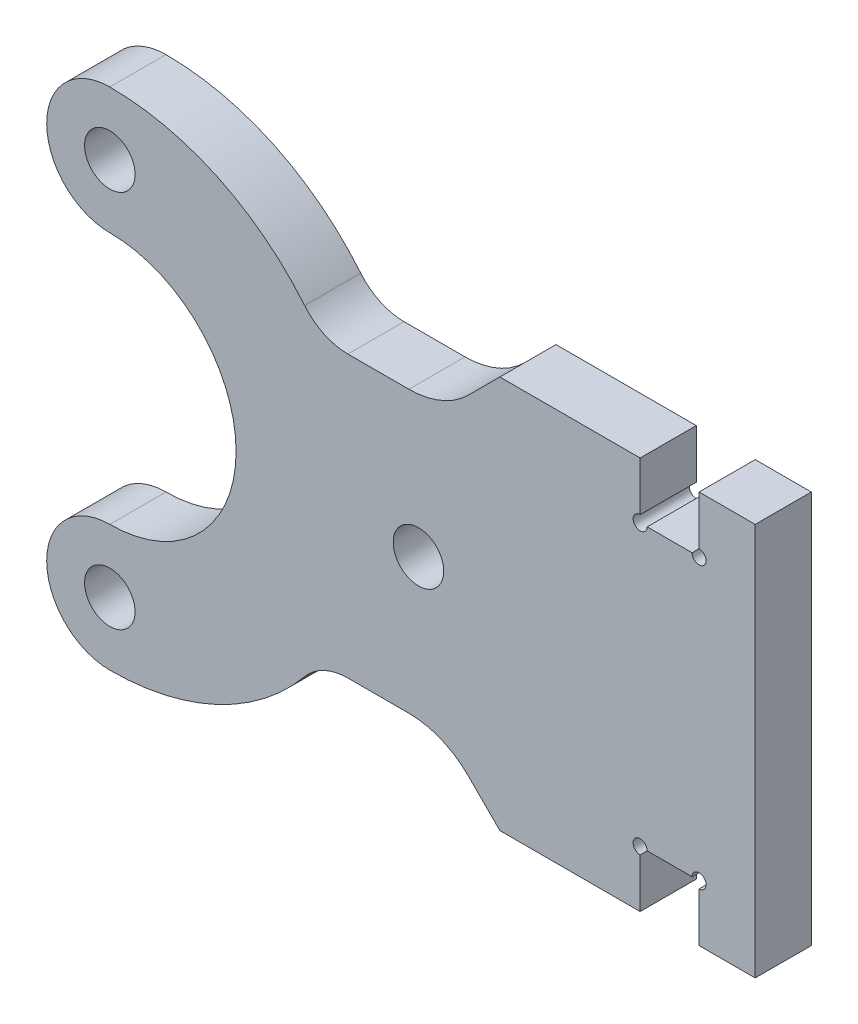
ISO-10303-21;
HEADER;
FILE_DESCRIPTION(('STEP AP214'),'2;1');
FILE_NAME('part.step','',(''),(''),'','','');
FILE_SCHEMA(('AUTOMOTIVE_DESIGN { 1 0 10303 214 1 1 1 1 }'));
ENDSEC;
DATA;
#1=APPLICATION_CONTEXT('core data for automotive mechanical design processes');
#2=APPLICATION_PROTOCOL_DEFINITION('international standard','automotive_design',2000,#1);
#3=PRODUCT_CONTEXT('',#1,'mechanical');
#4=PRODUCT('Part','Part','',(#3));
#5=PRODUCT_RELATED_PRODUCT_CATEGORY('part','',(#4));
#6=PRODUCT_DEFINITION_FORMATION('','',#4);
#7=PRODUCT_DEFINITION_CONTEXT('part definition',#1,'design');
#8=PRODUCT_DEFINITION('design','',#6,#7);
#9=PRODUCT_DEFINITION_SHAPE('','',#8);
#10=(LENGTH_UNIT() NAMED_UNIT(*) SI_UNIT(.MILLI.,.METRE.));
#11=(NAMED_UNIT(*) PLANE_ANGLE_UNIT() SI_UNIT($,.RADIAN.));
#12=(NAMED_UNIT(*) SI_UNIT($,.STERADIAN.) SOLID_ANGLE_UNIT());
#13=UNCERTAINTY_MEASURE_WITH_UNIT(LENGTH_MEASURE(1.E-05),#10,'distance_accuracy_value','');
#14=(GEOMETRIC_REPRESENTATION_CONTEXT(3) GLOBAL_UNCERTAINTY_ASSIGNED_CONTEXT((#13)) GLOBAL_UNIT_ASSIGNED_CONTEXT((#10,
#11,#12)) REPRESENTATION_CONTEXT('',''));
#15=CARTESIAN_POINT('',(0.,0.,0.));
#16=DIRECTION('',(0.,0.,1.));
#17=DIRECTION('',(1.,0.,0.));
#18=AXIS2_PLACEMENT_3D('',#15,#16,#17);
#19=CARTESIAN_POINT('',(0.,0.,2.));
#20=DIRECTION('',(0.,0.,-1.));
#21=DIRECTION('',(-1.,0.,0.));
#22=AXIS2_PLACEMENT_3D('',#19,#20,#21);
#23=PLANE('',#22);
#24=CARTESIAN_POINT('',(0.,0.,2.));
#25=DIRECTION('',(0.,0.,-1.));
#26=DIRECTION('',(-1.,0.,0.));
#27=AXIS2_PLACEMENT_3D('',#24,#25,#26);
#28=CIRCLE('',#27,4.5);
#29=CARTESIAN_POINT('',(0.,4.5,2.));
#30=VERTEX_POINT('',#29);
#31=CARTESIAN_POINT('',(0.,-4.5,2.));
#32=VERTEX_POINT('',#31);
#33=EDGE_CURVE('E306',#30,#32,#28,.T.);
#34=ORIENTED_EDGE('',*,*,#33,.T.);
#35=CARTESIAN_POINT('',(0.,-6.75,2.));
#36=DIRECTION('',(0.,0.,1.));
#37=DIRECTION('',(1.,0.,0.));
#38=AXIS2_PLACEMENT_3D('',#35,#36,#37);
#39=CIRCLE('',#38,2.25);
#40=CARTESIAN_POINT('',(0.,-9.,2.));
#41=VERTEX_POINT('',#40);
#42=EDGE_CURVE('E154',#32,#41,#39,.T.);
#43=ORIENTED_EDGE('',*,*,#42,.T.);
#44=CARTESIAN_POINT('',(0.,0.,2.));
#45=DIRECTION('',(0.,0.,1.));
#46=DIRECTION('',(1.,0.,0.));
#47=AXIS2_PLACEMENT_3D('',#44,#45,#46);
#48=CIRCLE('',#47,9.);
#49=CARTESIAN_POINT('',(6.94250294255883,-5.72727272727273,2.));
#50=VERTEX_POINT('',#49);
#51=EDGE_CURVE('E381',#41,#50,#48,.T.);
#52=ORIENTED_EDGE('',*,*,#51,.T.);
#53=CARTESIAN_POINT('',(8.48528137423857,-7.,2.));
#54=DIRECTION('',(0.,0.,-1.));
#55=DIRECTION('',(1.,0.,0.));
#56=AXIS2_PLACEMENT_3D('',#53,#54,#55);
#57=CIRCLE('',#56,2.);
#58=CARTESIAN_POINT('',(8.48528137423857,-5.,2.));
#59=VERTEX_POINT('',#58);
#60=EDGE_CURVE('E400',#50,#59,#57,.T.);
#61=ORIENTED_EDGE('',*,*,#60,.T.);
#62=DIRECTION('',(1.,0.,0.));
#63=VECTOR('',#62,1.);
#64=CARTESIAN_POINT('',(8.48528137423857,-5.,2.));
#65=LINE('',#64,#63);
#66=CARTESIAN_POINT('',(10.6573593128807,-5.,2.));
#67=VERTEX_POINT('',#66);
#68=EDGE_CURVE('E397',#59,#67,#65,.T.);
#69=ORIENTED_EDGE('',*,*,#68,.T.);
#70=CARTESIAN_POINT('',(10.6573593128807,-8.,2.));
#71=DIRECTION('',(0.,0.,-1.));
#72=DIRECTION('',(1.,0.,0.));
#73=AXIS2_PLACEMENT_3D('',#70,#71,#72);
#74=CIRCLE('',#73,3.);
#75=CARTESIAN_POINT('',(12.7786796564403,-5.87867965644035,2.));
#76=VERTEX_POINT('',#75);
#77=EDGE_CURVE('E399',#67,#76,#74,.T.);
#78=ORIENTED_EDGE('',*,*,#77,.T.);
#79=DIRECTION('',(0.707106781186552,-0.707106781186543,0.));
#80=VECTOR('',#79,1.);
#81=CARTESIAN_POINT('',(13.9,-7.,2.));
#82=LINE('',#81,#80);
#83=CARTESIAN_POINT('',(13.9,-7.,2.));
#84=VERTEX_POINT('',#83);
#85=EDGE_CURVE('E402',#76,#84,#82,.T.);
#86=ORIENTED_EDGE('',*,*,#85,.T.);
#87=DIRECTION('',(1.,0.,0.));
#88=VECTOR('',#87,1.);
#89=CARTESIAN_POINT('',(18.9,-7.,2.));
#90=LINE('',#89,#88);
#91=CARTESIAN_POINT('',(18.9,-7.,2.));
#92=VERTEX_POINT('',#91);
#93=EDGE_CURVE('E408',#84,#92,#90,.T.);
#94=ORIENTED_EDGE('',*,*,#93,.T.);
#95=DIRECTION('',(0.,1.,0.));
#96=VECTOR('',#95,1.);
#97=CARTESIAN_POINT('',(18.9,-5.25,2.));
#98=LINE('',#97,#96);
#99=CARTESIAN_POINT('',(18.9,-5.25,2.));
#100=VERTEX_POINT('',#99);
#101=EDGE_CURVE('E410',#92,#100,#98,.T.);
#102=ORIENTED_EDGE('',*,*,#101,.T.);
#103=CARTESIAN_POINT('',(18.9,-5.,2.));
#104=DIRECTION('',(0.,0.,-1.));
#105=DIRECTION('',(1.,0.,0.));
#106=AXIS2_PLACEMENT_3D('',#103,#104,#105);
#107=CIRCLE('',#106,0.25);
#108=CARTESIAN_POINT('',(19.15,-5.,2.));
#109=VERTEX_POINT('',#108);
#110=EDGE_CURVE('E412',#100,#109,#107,.T.);
#111=ORIENTED_EDGE('',*,*,#110,.T.);
#112=DIRECTION('',(1.,0.,0.));
#113=VECTOR('',#112,1.);
#114=CARTESIAN_POINT('',(19.15,-5.,2.));
#115=LINE('',#114,#113);
#116=CARTESIAN_POINT('',(20.75,-5.,2.));
#117=VERTEX_POINT('',#116);
#118=EDGE_CURVE('E414',#109,#117,#115,.T.);
#119=ORIENTED_EDGE('',*,*,#118,.T.);
#120=CARTESIAN_POINT('',(21.,-5.,2.));
#121=DIRECTION('',(0.,0.,-1.));
#122=DIRECTION('',(1.,0.,0.));
#123=AXIS2_PLACEMENT_3D('',#120,#121,#122);
#124=CIRCLE('',#123,0.25);
#125=CARTESIAN_POINT('',(21.,-5.25,2.));
#126=VERTEX_POINT('',#125);
#127=EDGE_CURVE('E416',#117,#126,#124,.T.);
#128=ORIENTED_EDGE('',*,*,#127,.T.);
#129=DIRECTION('',(0.,-1.,0.));
#130=VECTOR('',#129,1.);
#131=CARTESIAN_POINT('',(21.,-7.,2.));
#132=LINE('',#131,#130);
#133=CARTESIAN_POINT('',(21.,-7.,2.));
#134=VERTEX_POINT('',#133);
#135=EDGE_CURVE('E418',#126,#134,#132,.T.);
#136=ORIENTED_EDGE('',*,*,#135,.T.);
#137=DIRECTION('',(1.,0.,0.));
#138=VECTOR('',#137,1.);
#139=CARTESIAN_POINT('',(23.,-7.,2.));
#140=LINE('',#139,#138);
#141=CARTESIAN_POINT('',(23.,-7.,2.));
#142=VERTEX_POINT('',#141);
#143=EDGE_CURVE('E420',#134,#142,#140,.T.);
#144=ORIENTED_EDGE('',*,*,#143,.T.);
#145=DIRECTION('',(0.,1.,0.));
#146=VECTOR('',#145,1.);
#147=CARTESIAN_POINT('',(23.,7.,2.));
#148=LINE('',#147,#146);
#149=CARTESIAN_POINT('',(23.,7.,2.));
#150=VERTEX_POINT('',#149);
#151=EDGE_CURVE('E422',#142,#150,#148,.T.);
#152=ORIENTED_EDGE('',*,*,#151,.T.);
#153=DIRECTION('',(-1.,0.,0.));
#154=VECTOR('',#153,1.);
#155=CARTESIAN_POINT('',(23.,7.,2.));
#156=LINE('',#155,#154);
#157=CARTESIAN_POINT('',(21.,7.,2.));
#158=VERTEX_POINT('',#157);
#159=EDGE_CURVE('E424',#150,#158,#156,.T.);
#160=ORIENTED_EDGE('',*,*,#159,.T.);
#161=DIRECTION('',(0.,-1.,0.));
#162=VECTOR('',#161,1.);
#163=CARTESIAN_POINT('',(21.,7.,2.));
#164=LINE('',#163,#162);
#165=CARTESIAN_POINT('',(21.,5.25,2.));
#166=VERTEX_POINT('',#165);
#167=EDGE_CURVE('E426',#158,#166,#164,.T.);
#168=ORIENTED_EDGE('',*,*,#167,.T.);
#169=CARTESIAN_POINT('',(21.,5.,2.));
#170=DIRECTION('',(0.,0.,-1.));
#171=DIRECTION('',(1.,0.,0.));
#172=AXIS2_PLACEMENT_3D('',#169,#170,#171);
#173=CIRCLE('',#172,0.25);
#174=CARTESIAN_POINT('',(20.75,5.,2.));
#175=VERTEX_POINT('',#174);
#176=EDGE_CURVE('E428',#166,#175,#173,.T.);
#177=ORIENTED_EDGE('',*,*,#176,.T.);
#178=DIRECTION('',(-1.,0.,0.));
#179=VECTOR('',#178,1.);
#180=CARTESIAN_POINT('',(19.15,5.,2.));
#181=LINE('',#180,#179);
#182=CARTESIAN_POINT('',(19.15,5.,2.));
#183=VERTEX_POINT('',#182);
#184=EDGE_CURVE('E430',#175,#183,#181,.T.);
#185=ORIENTED_EDGE('',*,*,#184,.T.);
#186=CARTESIAN_POINT('',(18.9,5.,2.));
#187=DIRECTION('',(0.,0.,-1.));
#188=DIRECTION('',(1.,0.,0.));
#189=AXIS2_PLACEMENT_3D('',#186,#187,#188);
#190=CIRCLE('',#189,0.25);
#191=CARTESIAN_POINT('',(18.9,5.25,2.));
#192=VERTEX_POINT('',#191);
#193=EDGE_CURVE('E432',#183,#192,#190,.T.);
#194=ORIENTED_EDGE('',*,*,#193,.T.);
#195=DIRECTION('',(0.,1.,0.));
#196=VECTOR('',#195,1.);
#197=CARTESIAN_POINT('',(18.9,5.25,2.));
#198=LINE('',#197,#196);
#199=CARTESIAN_POINT('',(18.9,7.,2.));
#200=VERTEX_POINT('',#199);
#201=EDGE_CURVE('E434',#192,#200,#198,.T.);
#202=ORIENTED_EDGE('',*,*,#201,.T.);
#203=DIRECTION('',(-1.,0.,0.));
#204=VECTOR('',#203,1.);
#205=CARTESIAN_POINT('',(18.9,7.,2.));
#206=LINE('',#205,#204);
#207=CARTESIAN_POINT('',(13.9,7.,2.));
#208=VERTEX_POINT('',#207);
#209=EDGE_CURVE('E436',#200,#208,#206,.T.);
#210=ORIENTED_EDGE('',*,*,#209,.T.);
#211=DIRECTION('',(-0.707106781186552,-0.707106781186543,0.));
#212=VECTOR('',#211,1.);
#213=CARTESIAN_POINT('',(13.9,7.,2.));
#214=LINE('',#213,#212);
#215=CARTESIAN_POINT('',(12.7786796564403,5.87867965644035,2.));
#216=VERTEX_POINT('',#215);
#217=EDGE_CURVE('E438',#208,#216,#214,.T.);
#218=ORIENTED_EDGE('',*,*,#217,.T.);
#219=CARTESIAN_POINT('',(10.6573593128807,8.,2.));
#220=DIRECTION('',(0.,0.,-1.));
#221=DIRECTION('',(-1.,0.,0.));
#222=AXIS2_PLACEMENT_3D('',#219,#220,#221);
#223=CIRCLE('',#222,3.);
#224=CARTESIAN_POINT('',(10.6573593128807,5.,2.));
#225=VERTEX_POINT('',#224);
#226=EDGE_CURVE('E440',#216,#225,#223,.T.);
#227=ORIENTED_EDGE('',*,*,#226,.T.);
#228=DIRECTION('',(-1.,0.,0.));
#229=VECTOR('',#228,1.);
#230=CARTESIAN_POINT('',(8.48528137423857,5.,2.));
#231=LINE('',#230,#229);
#232=CARTESIAN_POINT('',(8.48528137423857,5.,2.));
#233=VERTEX_POINT('',#232);
#234=EDGE_CURVE('E233',#225,#233,#231,.T.);
#235=ORIENTED_EDGE('',*,*,#234,.T.);
#236=CARTESIAN_POINT('',(8.48528137423857,7.,2.));
#237=DIRECTION('',(0.,0.,-1.));
#238=DIRECTION('',(-1.,0.,0.));
#239=AXIS2_PLACEMENT_3D('',#236,#237,#238);
#240=CIRCLE('',#239,2.);
#241=CARTESIAN_POINT('',(6.94250294255883,5.72727272727273,2.));
#242=VERTEX_POINT('',#241);
#243=EDGE_CURVE('E227',#233,#242,#240,.T.);
#244=ORIENTED_EDGE('',*,*,#243,.T.);
#245=CARTESIAN_POINT('',(0.,0.,2.));
#246=DIRECTION('',(0.,0.,1.));
#247=DIRECTION('',(1.,0.,0.));
#248=AXIS2_PLACEMENT_3D('',#245,#246,#247);
#249=CIRCLE('',#248,9.);
#250=CARTESIAN_POINT('',(0.,9.,2.));
#251=VERTEX_POINT('',#250);
#252=EDGE_CURVE('E231',#242,#251,#249,.T.);
#253=ORIENTED_EDGE('',*,*,#252,.T.);
#254=CARTESIAN_POINT('',(0.,6.75,2.));
#255=DIRECTION('',(0.,0.,1.));
#256=DIRECTION('',(1.,0.,0.));
#257=AXIS2_PLACEMENT_3D('',#254,#255,#256);
#258=CIRCLE('',#257,2.25);
#259=EDGE_CURVE('E51',#251,#30,#258,.T.);
#260=ORIENTED_EDGE('',*,*,#259,.T.);
#261=EDGE_LOOP('',(#34,#43,#52,#61,#69,#78,#86,#94,#102,#111,#119,#128,#136,#144,#152,#160,#168,
#177,#185,#194,#202,#210,#218,#227,#235,#244,#253,#260));
#262=FACE_BOUND('',#261,.T.);
#263=CARTESIAN_POINT('',(0.,6.75,2.));
#264=DIRECTION('',(0.,0.,1.));
#265=DIRECTION('',(1.,0.,0.));
#266=AXIS2_PLACEMENT_3D('',#263,#264,#265);
#267=CIRCLE('',#266,0.9);
#268=CARTESIAN_POINT('',(0.9,6.75,2.));
#269=VERTEX_POINT('',#268);
#270=EDGE_CURVE('E255',#269,#269,#267,.T.);
#271=ORIENTED_EDGE('',*,*,#270,.F.);
#272=EDGE_LOOP('',(#271));
#273=FACE_BOUND('',#272,.T.);
#274=CARTESIAN_POINT('',(0.,-6.75,2.));
#275=DIRECTION('',(0.,0.,1.));
#276=DIRECTION('',(1.,0.,0.));
#277=AXIS2_PLACEMENT_3D('',#274,#275,#276);
#278=CIRCLE('',#277,0.9);
#279=CARTESIAN_POINT('',(0.9,-6.75,2.));
#280=VERTEX_POINT('',#279);
#281=EDGE_CURVE('E494',#280,#280,#278,.T.);
#282=ORIENTED_EDGE('',*,*,#281,.F.);
#283=EDGE_LOOP('',(#282));
#284=FACE_BOUND('',#283,.T.);
#285=CARTESIAN_POINT('',(11.,0.,2.));
#286=DIRECTION('',(0.,0.,1.));
#287=DIRECTION('',(1.,0.,0.));
#288=AXIS2_PLACEMENT_3D('',#285,#286,#287);
#289=CIRCLE('',#288,0.9);
#290=CARTESIAN_POINT('',(11.9,0.,2.));
#291=VERTEX_POINT('',#290);
#292=EDGE_CURVE('E485',#291,#291,#289,.T.);
#293=ORIENTED_EDGE('',*,*,#292,.F.);
#294=EDGE_LOOP('',(#293));
#295=FACE_BOUND('',#294,.T.);
#296=ADVANCED_FACE('F34',(#262,#273,#284,#295),#23,.F.);
#297=CARTESIAN_POINT('',(0.,0.,0.));
#298=DIRECTION('',(0.,0.,-1.));
#299=DIRECTION('',(-1.,0.,0.));
#300=AXIS2_PLACEMENT_3D('',#297,#298,#299);
#301=PLANE('',#300);
#302=CARTESIAN_POINT('',(0.,-6.75,0.));
#303=DIRECTION('',(0.,0.,1.));
#304=DIRECTION('',(1.,0.,0.));
#305=AXIS2_PLACEMENT_3D('',#302,#303,#304);
#306=CIRCLE('',#305,0.9);
#307=CARTESIAN_POINT('',(0.9,-6.75,0.));
#308=VERTEX_POINT('',#307);
#309=EDGE_CURVE('E491',#308,#308,#306,.T.);
#310=ORIENTED_EDGE('',*,*,#309,.T.);
#311=EDGE_LOOP('',(#310));
#312=FACE_BOUND('',#311,.T.);
#313=CARTESIAN_POINT('',(0.,0.,0.));
#314=DIRECTION('',(0.,0.,-1.));
#315=DIRECTION('',(-1.,0.,0.));
#316=AXIS2_PLACEMENT_3D('',#313,#314,#315);
#317=CIRCLE('',#316,4.5);
#318=CARTESIAN_POINT('',(0.,4.5,0.));
#319=VERTEX_POINT('',#318);
#320=CARTESIAN_POINT('',(0.,-4.5,0.));
#321=VERTEX_POINT('',#320);
#322=EDGE_CURVE('E251',#319,#321,#317,.T.);
#323=ORIENTED_EDGE('',*,*,#322,.F.);
#324=CARTESIAN_POINT('',(0.,6.75,0.));
#325=DIRECTION('',(0.,0.,1.));
#326=DIRECTION('',(1.,0.,0.));
#327=AXIS2_PLACEMENT_3D('',#324,#325,#326);
#328=CIRCLE('',#327,2.25);
#329=CARTESIAN_POINT('',(0.,9.,0.));
#330=VERTEX_POINT('',#329);
#331=EDGE_CURVE('E146',#330,#319,#328,.T.);
#332=ORIENTED_EDGE('',*,*,#331,.F.);
#333=CARTESIAN_POINT('',(0.,0.,0.));
#334=DIRECTION('',(0.,0.,1.));
#335=DIRECTION('',(1.,0.,0.));
#336=AXIS2_PLACEMENT_3D('',#333,#334,#335);
#337=CIRCLE('',#336,9.);
#338=CARTESIAN_POINT('',(6.94250294255883,5.72727272727273,0.));
#339=VERTEX_POINT('',#338);
#340=EDGE_CURVE('E140',#339,#330,#337,.T.);
#341=ORIENTED_EDGE('',*,*,#340,.F.);
#342=CARTESIAN_POINT('',(8.48528137423857,7.,0.));
#343=DIRECTION('',(0.,0.,-1.));
#344=DIRECTION('',(-1.,0.,0.));
#345=AXIS2_PLACEMENT_3D('',#342,#343,#344);
#346=CIRCLE('',#345,2.);
#347=CARTESIAN_POINT('',(8.48528137423857,5.,0.));
#348=VERTEX_POINT('',#347);
#349=EDGE_CURVE('E241',#348,#339,#346,.T.);
#350=ORIENTED_EDGE('',*,*,#349,.F.);
#351=DIRECTION('',(-1.,0.,0.));
#352=VECTOR('',#351,1.);
#353=CARTESIAN_POINT('',(8.48528137423857,5.,0.));
#354=LINE('',#353,#352);
#355=CARTESIAN_POINT('',(10.6573593128807,5.,0.));
#356=VERTEX_POINT('',#355);
#357=EDGE_CURVE('E301',#356,#348,#354,.T.);
#358=ORIENTED_EDGE('',*,*,#357,.F.);
#359=CARTESIAN_POINT('',(10.6573593128807,8.,0.));
#360=DIRECTION('',(0.,0.,-1.));
#361=DIRECTION('',(-1.,0.,0.));
#362=AXIS2_PLACEMENT_3D('',#359,#360,#361);
#363=CIRCLE('',#362,3.);
#364=CARTESIAN_POINT('',(12.7786796564403,5.87867965644035,0.));
#365=VERTEX_POINT('',#364);
#366=EDGE_CURVE('E299',#365,#356,#363,.T.);
#367=ORIENTED_EDGE('',*,*,#366,.F.);
#368=DIRECTION('',(-0.707106781186552,-0.707106781186543,0.));
#369=VECTOR('',#368,1.);
#370=CARTESIAN_POINT('',(13.9,7.,0.));
#371=LINE('',#370,#369);
#372=CARTESIAN_POINT('',(13.9,7.,0.));
#373=VERTEX_POINT('',#372);
#374=EDGE_CURVE('E297',#373,#365,#371,.T.);
#375=ORIENTED_EDGE('',*,*,#374,.F.);
#376=DIRECTION('',(-1.,0.,0.));
#377=VECTOR('',#376,1.);
#378=CARTESIAN_POINT('',(18.9,7.,0.));
#379=LINE('',#378,#377);
#380=CARTESIAN_POINT('',(18.9,7.,0.));
#381=VERTEX_POINT('',#380);
#382=EDGE_CURVE('E295',#381,#373,#379,.T.);
#383=ORIENTED_EDGE('',*,*,#382,.F.);
#384=DIRECTION('',(0.,1.,0.));
#385=VECTOR('',#384,1.);
#386=CARTESIAN_POINT('',(18.9,5.25,0.));
#387=LINE('',#386,#385);
#388=CARTESIAN_POINT('',(18.9,5.25,0.));
#389=VERTEX_POINT('',#388);
#390=EDGE_CURVE('E293',#389,#381,#387,.T.);
#391=ORIENTED_EDGE('',*,*,#390,.F.);
#392=CARTESIAN_POINT('',(18.9,5.,0.));
#393=DIRECTION('',(0.,0.,-1.));
#394=DIRECTION('',(1.,0.,0.));
#395=AXIS2_PLACEMENT_3D('',#392,#393,#394);
#396=CIRCLE('',#395,0.25);
#397=CARTESIAN_POINT('',(19.15,5.,0.));
#398=VERTEX_POINT('',#397);
#399=EDGE_CURVE('E291',#398,#389,#396,.T.);
#400=ORIENTED_EDGE('',*,*,#399,.F.);
#401=DIRECTION('',(-1.,0.,0.));
#402=VECTOR('',#401,1.);
#403=CARTESIAN_POINT('',(19.15,5.,0.));
#404=LINE('',#403,#402);
#405=CARTESIAN_POINT('',(20.75,5.,0.));
#406=VERTEX_POINT('',#405);
#407=EDGE_CURVE('E289',#406,#398,#404,.T.);
#408=ORIENTED_EDGE('',*,*,#407,.F.);
#409=CARTESIAN_POINT('',(21.,5.,0.));
#410=DIRECTION('',(0.,0.,-1.));
#411=DIRECTION('',(1.,0.,0.));
#412=AXIS2_PLACEMENT_3D('',#409,#410,#411);
#413=CIRCLE('',#412,0.25);
#414=CARTESIAN_POINT('',(21.,5.25,0.));
#415=VERTEX_POINT('',#414);
#416=EDGE_CURVE('E287',#415,#406,#413,.T.);
#417=ORIENTED_EDGE('',*,*,#416,.F.);
#418=DIRECTION('',(0.,-1.,0.));
#419=VECTOR('',#418,1.);
#420=CARTESIAN_POINT('',(21.,7.,0.));
#421=LINE('',#420,#419);
#422=CARTESIAN_POINT('',(21.,7.,0.));
#423=VERTEX_POINT('',#422);
#424=EDGE_CURVE('E285',#423,#415,#421,.T.);
#425=ORIENTED_EDGE('',*,*,#424,.F.);
#426=DIRECTION('',(-1.,0.,0.));
#427=VECTOR('',#426,1.);
#428=CARTESIAN_POINT('',(23.,7.,0.));
#429=LINE('',#428,#427);
#430=CARTESIAN_POINT('',(23.,7.,0.));
#431=VERTEX_POINT('',#430);
#432=EDGE_CURVE('E283',#431,#423,#429,.T.);
#433=ORIENTED_EDGE('',*,*,#432,.F.);
#434=DIRECTION('',(0.,1.,0.));
#435=VECTOR('',#434,1.);
#436=CARTESIAN_POINT('',(23.,7.,0.));
#437=LINE('',#436,#435);
#438=CARTESIAN_POINT('',(23.,-7.,0.));
#439=VERTEX_POINT('',#438);
#440=EDGE_CURVE('E281',#439,#431,#437,.T.);
#441=ORIENTED_EDGE('',*,*,#440,.F.);
#442=DIRECTION('',(1.,0.,0.));
#443=VECTOR('',#442,1.);
#444=CARTESIAN_POINT('',(23.,-7.,0.));
#445=LINE('',#444,#443);
#446=CARTESIAN_POINT('',(21.,-7.,0.));
#447=VERTEX_POINT('',#446);
#448=EDGE_CURVE('E279',#447,#439,#445,.T.);
#449=ORIENTED_EDGE('',*,*,#448,.F.);
#450=DIRECTION('',(0.,-1.,0.));
#451=VECTOR('',#450,1.);
#452=CARTESIAN_POINT('',(21.,-7.,0.));
#453=LINE('',#452,#451);
#454=CARTESIAN_POINT('',(21.,-5.25,0.));
#455=VERTEX_POINT('',#454);
#456=EDGE_CURVE('E277',#455,#447,#453,.T.);
#457=ORIENTED_EDGE('',*,*,#456,.F.);
#458=CARTESIAN_POINT('',(21.,-5.,0.));
#459=DIRECTION('',(0.,0.,-1.));
#460=DIRECTION('',(1.,0.,0.));
#461=AXIS2_PLACEMENT_3D('',#458,#459,#460);
#462=CIRCLE('',#461,0.25);
#463=CARTESIAN_POINT('',(20.75,-5.,0.));
#464=VERTEX_POINT('',#463);
#465=EDGE_CURVE('E275',#464,#455,#462,.T.);
#466=ORIENTED_EDGE('',*,*,#465,.F.);
#467=DIRECTION('',(1.,0.,0.));
#468=VECTOR('',#467,1.);
#469=CARTESIAN_POINT('',(19.15,-5.,0.));
#470=LINE('',#469,#468);
#471=CARTESIAN_POINT('',(19.15,-5.,0.));
#472=VERTEX_POINT('',#471);
#473=EDGE_CURVE('E273',#472,#464,#470,.T.);
#474=ORIENTED_EDGE('',*,*,#473,.F.);
#475=CARTESIAN_POINT('',(18.9,-5.,0.));
#476=DIRECTION('',(0.,0.,-1.));
#477=DIRECTION('',(1.,0.,0.));
#478=AXIS2_PLACEMENT_3D('',#475,#476,#477);
#479=CIRCLE('',#478,0.25);
#480=CARTESIAN_POINT('',(18.9,-5.25,0.));
#481=VERTEX_POINT('',#480);
#482=EDGE_CURVE('E271',#481,#472,#479,.T.);
#483=ORIENTED_EDGE('',*,*,#482,.F.);
#484=DIRECTION('',(0.,1.,0.));
#485=VECTOR('',#484,1.);
#486=CARTESIAN_POINT('',(18.9,-5.25,0.));
#487=LINE('',#486,#485);
#488=CARTESIAN_POINT('',(18.9,-7.,0.));
#489=VERTEX_POINT('',#488);
#490=EDGE_CURVE('E269',#489,#481,#487,.T.);
#491=ORIENTED_EDGE('',*,*,#490,.F.);
#492=DIRECTION('',(1.,0.,0.));
#493=VECTOR('',#492,1.);
#494=CARTESIAN_POINT('',(18.9,-7.,0.));
#495=LINE('',#494,#493);
#496=CARTESIAN_POINT('',(13.9,-7.,0.));
#497=VERTEX_POINT('',#496);
#498=EDGE_CURVE('E267',#497,#489,#495,.T.);
#499=ORIENTED_EDGE('',*,*,#498,.F.);
#500=DIRECTION('',(0.707106781186552,-0.707106781186543,0.));
#501=VECTOR('',#500,1.);
#502=CARTESIAN_POINT('',(13.9,-7.,0.));
#503=LINE('',#502,#501);
#504=CARTESIAN_POINT('',(12.7786796564403,-5.87867965644035,0.));
#505=VERTEX_POINT('',#504);
#506=EDGE_CURVE('E265',#505,#497,#503,.T.);
#507=ORIENTED_EDGE('',*,*,#506,.F.);
#508=CARTESIAN_POINT('',(10.6573593128807,-8.,0.));
#509=DIRECTION('',(0.,0.,-1.));
#510=DIRECTION('',(1.,0.,0.));
#511=AXIS2_PLACEMENT_3D('',#508,#509,#510);
#512=CIRCLE('',#511,3.);
#513=CARTESIAN_POINT('',(10.6573593128807,-5.,0.));
#514=VERTEX_POINT('',#513);
#515=EDGE_CURVE('E263',#514,#505,#512,.T.);
#516=ORIENTED_EDGE('',*,*,#515,.F.);
#517=DIRECTION('',(1.,0.,0.));
#518=VECTOR('',#517,1.);
#519=CARTESIAN_POINT('',(8.48528137423857,-5.,0.));
#520=LINE('',#519,#518);
#521=CARTESIAN_POINT('',(8.48528137423857,-5.,0.));
#522=VERTEX_POINT('',#521);
#523=EDGE_CURVE('E261',#522,#514,#520,.T.);
#524=ORIENTED_EDGE('',*,*,#523,.F.);
#525=CARTESIAN_POINT('',(8.48528137423857,-7.,0.));
#526=DIRECTION('',(0.,0.,-1.));
#527=DIRECTION('',(1.,0.,0.));
#528=AXIS2_PLACEMENT_3D('',#525,#526,#527);
#529=CIRCLE('',#528,2.);
#530=CARTESIAN_POINT('',(6.94250294255883,-5.72727272727273,0.));
#531=VERTEX_POINT('',#530);
#532=EDGE_CURVE('E259',#531,#522,#529,.T.);
#533=ORIENTED_EDGE('',*,*,#532,.F.);
#534=CARTESIAN_POINT('',(0.,0.,0.));
#535=DIRECTION('',(0.,0.,1.));
#536=DIRECTION('',(1.,0.,0.));
#537=AXIS2_PLACEMENT_3D('',#534,#535,#536);
#538=CIRCLE('',#537,9.);
#539=CARTESIAN_POINT('',(0.,-9.,0.));
#540=VERTEX_POINT('',#539);
#541=EDGE_CURVE('E257',#540,#531,#538,.T.);
#542=ORIENTED_EDGE('',*,*,#541,.F.);
#543=CARTESIAN_POINT('',(0.,-6.75,0.));
#544=DIRECTION('',(0.,0.,1.));
#545=DIRECTION('',(1.,0.,0.));
#546=AXIS2_PLACEMENT_3D('',#543,#544,#545);
#547=CIRCLE('',#546,2.25);
#548=EDGE_CURVE('E254',#321,#540,#547,.T.);
#549=ORIENTED_EDGE('',*,*,#548,.F.);
#550=EDGE_LOOP('',(#323,#332,#341,#350,#358,#367,#375,#383,#391,#400,#408,#417,#425,#433,#441,
#449,#457,#466,#474,#483,#491,#499,#507,#516,#524,#533,#542,#549));
#551=FACE_BOUND('',#550,.T.);
#552=CARTESIAN_POINT('',(0.,6.75,0.));
#553=DIRECTION('',(0.,0.,1.));
#554=DIRECTION('',(1.,0.,0.));
#555=AXIS2_PLACEMENT_3D('',#552,#553,#554);
#556=CIRCLE('',#555,0.9);
#557=CARTESIAN_POINT('',(0.9,6.75,0.));
#558=VERTEX_POINT('',#557);
#559=EDGE_CURVE('E497',#558,#558,#556,.T.);
#560=ORIENTED_EDGE('',*,*,#559,.T.);
#561=EDGE_LOOP('',(#560));
#562=FACE_BOUND('',#561,.T.);
#563=CARTESIAN_POINT('',(11.,0.,0.));
#564=DIRECTION('',(0.,0.,1.));
#565=DIRECTION('',(1.,0.,0.));
#566=AXIS2_PLACEMENT_3D('',#563,#564,#565);
#567=CIRCLE('',#566,0.9);
#568=CARTESIAN_POINT('',(11.9,0.,0.));
#569=VERTEX_POINT('',#568);
#570=EDGE_CURVE('E488',#569,#569,#567,.T.);
#571=ORIENTED_EDGE('',*,*,#570,.T.);
#572=EDGE_LOOP('',(#571));
#573=FACE_BOUND('',#572,.T.);
#574=ADVANCED_FACE('F385',(#312,#551,#562,#573),#301,.T.);
#575=CARTESIAN_POINT('',(0.,0.,2.));
#576=DIRECTION('',(0.,0.,-1.));
#577=DIRECTION('',(-1.,0.,0.));
#578=AXIS2_PLACEMENT_3D('',#575,#576,#577);
#579=CYLINDRICAL_SURFACE('',#578,4.5);
#580=ORIENTED_EDGE('',*,*,#322,.T.);
#581=DIRECTION('',(0.,0.,-1.));
#582=VECTOR('',#581,1.);
#583=CARTESIAN_POINT('',(0.,-4.5,2.));
#584=LINE('',#583,#582);
#585=EDGE_CURVE('E11',#32,#321,#584,.T.);
#586=ORIENTED_EDGE('',*,*,#585,.F.);
#587=ORIENTED_EDGE('',*,*,#33,.F.);
#588=DIRECTION('',(0.,0.,-1.));
#589=VECTOR('',#588,1.);
#590=CARTESIAN_POINT('',(0.,4.5,2.));
#591=LINE('',#590,#589);
#592=EDGE_CURVE('E247',#30,#319,#591,.T.);
#593=ORIENTED_EDGE('',*,*,#592,.T.);
#594=EDGE_LOOP('',(#580,#586,#587,#593));
#595=FACE_BOUND('',#594,.T.);
#596=ADVANCED_FACE('F36',(#595),#579,.F.);
#597=CARTESIAN_POINT('',(0.,-6.75,2.));
#598=DIRECTION('',(0.,0.,-1.));
#599=DIRECTION('',(-1.,0.,0.));
#600=AXIS2_PLACEMENT_3D('',#597,#598,#599);
#601=CYLINDRICAL_SURFACE('',#600,2.25);
#602=ORIENTED_EDGE('',*,*,#548,.T.);
#603=DIRECTION('',(0.,0.,-1.));
#604=VECTOR('',#603,1.);
#605=CARTESIAN_POINT('',(0.,-9.,2.));
#606=LINE('',#605,#604);
#607=EDGE_CURVE('E43',#41,#540,#606,.T.);
#608=ORIENTED_EDGE('',*,*,#607,.F.);
#609=ORIENTED_EDGE('',*,*,#42,.F.);
#610=ORIENTED_EDGE('',*,*,#585,.T.);
#611=EDGE_LOOP('',(#602,#608,#609,#610));
#612=FACE_BOUND('',#611,.T.);
#613=ADVANCED_FACE('F760',(#612),#601,.T.);
#614=CARTESIAN_POINT('',(0.,0.,2.));
#615=DIRECTION('',(0.,0.,-1.));
#616=DIRECTION('',(-1.,0.,0.));
#617=AXIS2_PLACEMENT_3D('',#614,#615,#616);
#618=CYLINDRICAL_SURFACE('',#617,9.);
#619=ORIENTED_EDGE('',*,*,#541,.T.);
#620=DIRECTION('',(0.,0.,-1.));
#621=VECTOR('',#620,1.);
#622=CARTESIAN_POINT('',(6.94250294255883,-5.72727272727273,2.));
#623=LINE('',#622,#621);
#624=EDGE_CURVE('E373',#50,#531,#623,.T.);
#625=ORIENTED_EDGE('',*,*,#624,.F.);
#626=ORIENTED_EDGE('',*,*,#51,.F.);
#627=ORIENTED_EDGE('',*,*,#607,.T.);
#628=EDGE_LOOP('',(#619,#625,#626,#627));
#629=FACE_BOUND('',#628,.T.);
#630=ADVANCED_FACE('F379',(#629),#618,.T.);
#631=CARTESIAN_POINT('',(8.48528137423857,-7.,2.));
#632=DIRECTION('',(0.,0.,-1.));
#633=DIRECTION('',(-1.,0.,0.));
#634=AXIS2_PLACEMENT_3D('',#631,#632,#633);
#635=CYLINDRICAL_SURFACE('',#634,2.);
#636=ORIENTED_EDGE('',*,*,#532,.T.);
#637=DIRECTION('',(0.,0.,-1.));
#638=VECTOR('',#637,1.);
#639=CARTESIAN_POINT('',(8.48528137423857,-5.,2.));
#640=LINE('',#639,#638);
#641=EDGE_CURVE('E370',#59,#522,#640,.T.);
#642=ORIENTED_EDGE('',*,*,#641,.F.);
#643=ORIENTED_EDGE('',*,*,#60,.F.);
#644=ORIENTED_EDGE('',*,*,#624,.T.);
#645=EDGE_LOOP('',(#636,#642,#643,#644));
#646=FACE_BOUND('',#645,.T.);
#647=ADVANCED_FACE('F391',(#646),#635,.F.);
#648=CARTESIAN_POINT('',(8.48528137423857,-5.,2.));
#649=DIRECTION('',(0.,1.,0.));
#650=DIRECTION('',(-1.,0.,0.));
#651=AXIS2_PLACEMENT_3D('',#648,#649,#650);
#652=PLANE('',#651);
#653=ORIENTED_EDGE('',*,*,#523,.T.);
#654=DIRECTION('',(0.,0.,-1.));
#655=VECTOR('',#654,1.);
#656=CARTESIAN_POINT('',(10.6573593128807,-5.,2.));
#657=LINE('',#656,#655);
#658=EDGE_CURVE('E367',#67,#514,#657,.T.);
#659=ORIENTED_EDGE('',*,*,#658,.F.);
#660=ORIENTED_EDGE('',*,*,#68,.F.);
#661=ORIENTED_EDGE('',*,*,#641,.T.);
#662=EDGE_LOOP('',(#653,#659,#660,#661));
#663=FACE_BOUND('',#662,.T.);
#664=ADVANCED_FACE('F395',(#663),#652,.F.);
#665=CARTESIAN_POINT('',(10.6573593128807,-8.,2.));
#666=DIRECTION('',(0.,0.,-1.));
#667=DIRECTION('',(-1.,0.,0.));
#668=AXIS2_PLACEMENT_3D('',#665,#666,#667);
#669=CYLINDRICAL_SURFACE('',#668,3.);
#670=ORIENTED_EDGE('',*,*,#515,.T.);
#671=DIRECTION('',(0.,0.,-1.));
#672=VECTOR('',#671,1.);
#673=CARTESIAN_POINT('',(12.7786796564403,-5.87867965644035,2.));
#674=LINE('',#673,#672);
#675=EDGE_CURVE('E364',#76,#505,#674,.T.);
#676=ORIENTED_EDGE('',*,*,#675,.F.);
#677=ORIENTED_EDGE('',*,*,#77,.F.);
#678=ORIENTED_EDGE('',*,*,#658,.T.);
#679=EDGE_LOOP('',(#670,#676,#677,#678));
#680=FACE_BOUND('',#679,.T.);
#681=ADVANCED_FACE('F725',(#680),#669,.F.);
#682=CARTESIAN_POINT('',(13.9,-7.,2.));
#683=DIRECTION('',(0.707106781186543,0.707106781186552,0.));
#684=DIRECTION('',(-0.707106781186552,0.707106781186543,0.));
#685=AXIS2_PLACEMENT_3D('',#682,#683,#684);
#686=PLANE('',#685);
#687=ORIENTED_EDGE('',*,*,#506,.T.);
#688=DIRECTION('',(0.,0.,-1.));
#689=VECTOR('',#688,1.);
#690=CARTESIAN_POINT('',(13.9,-7.,2.));
#691=LINE('',#690,#689);
#692=EDGE_CURVE('E361',#84,#497,#691,.T.);
#693=ORIENTED_EDGE('',*,*,#692,.F.);
#694=ORIENTED_EDGE('',*,*,#85,.F.);
#695=ORIENTED_EDGE('',*,*,#675,.T.);
#696=EDGE_LOOP('',(#687,#693,#694,#695));
#697=FACE_BOUND('',#696,.T.);
#698=ADVANCED_FACE('F715',(#697),#686,.F.);
#699=CARTESIAN_POINT('',(18.9,-7.,2.));
#700=DIRECTION('',(0.,1.,0.));
#701=DIRECTION('',(-1.,0.,0.));
#702=AXIS2_PLACEMENT_3D('',#699,#700,#701);
#703=PLANE('',#702);
#704=ORIENTED_EDGE('',*,*,#498,.T.);
#705=DIRECTION('',(0.,0.,-1.));
#706=VECTOR('',#705,1.);
#707=CARTESIAN_POINT('',(18.9,-7.,2.));
#708=LINE('',#707,#706);
#709=EDGE_CURVE('E358',#92,#489,#708,.T.);
#710=ORIENTED_EDGE('',*,*,#709,.F.);
#711=ORIENTED_EDGE('',*,*,#93,.F.);
#712=ORIENTED_EDGE('',*,*,#692,.T.);
#713=EDGE_LOOP('',(#704,#710,#711,#712));
#714=FACE_BOUND('',#713,.T.);
#715=ADVANCED_FACE('F705',(#714),#703,.F.);
#716=CARTESIAN_POINT('',(18.9,-5.25,2.));
#717=DIRECTION('',(-1.,0.,0.));
#718=DIRECTION('',(0.,0.,1.));
#719=AXIS2_PLACEMENT_3D('',#716,#717,#718);
#720=PLANE('',#719);
#721=ORIENTED_EDGE('',*,*,#490,.T.);
#722=DIRECTION('',(0.,0.,-1.));
#723=VECTOR('',#722,1.);
#724=CARTESIAN_POINT('',(18.9,-5.25,2.));
#725=LINE('',#724,#723);
#726=EDGE_CURVE('E355',#100,#481,#725,.T.);
#727=ORIENTED_EDGE('',*,*,#726,.F.);
#728=ORIENTED_EDGE('',*,*,#101,.F.);
#729=ORIENTED_EDGE('',*,*,#709,.T.);
#730=EDGE_LOOP('',(#721,#727,#728,#729));
#731=FACE_BOUND('',#730,.T.);
#732=ADVANCED_FACE('F695',(#731),#720,.F.);
#733=CARTESIAN_POINT('',(18.9,-5.,2.));
#734=DIRECTION('',(0.,0.,-1.));
#735=DIRECTION('',(-1.,0.,0.));
#736=AXIS2_PLACEMENT_3D('',#733,#734,#735);
#737=CYLINDRICAL_SURFACE('',#736,0.25);
#738=ORIENTED_EDGE('',*,*,#482,.T.);
#739=DIRECTION('',(0.,0.,-1.));
#740=VECTOR('',#739,1.);
#741=CARTESIAN_POINT('',(19.15,-5.,2.));
#742=LINE('',#741,#740);
#743=EDGE_CURVE('E352',#109,#472,#742,.T.);
#744=ORIENTED_EDGE('',*,*,#743,.F.);
#745=ORIENTED_EDGE('',*,*,#110,.F.);
#746=ORIENTED_EDGE('',*,*,#726,.T.);
#747=EDGE_LOOP('',(#738,#744,#745,#746));
#748=FACE_BOUND('',#747,.T.);
#749=ADVANCED_FACE('F685',(#748),#737,.F.);
#750=CARTESIAN_POINT('',(19.15,-5.,2.));
#751=DIRECTION('',(0.,1.,0.));
#752=DIRECTION('',(0.,0.,1.));
#753=AXIS2_PLACEMENT_3D('',#750,#751,#752);
#754=PLANE('',#753);
#755=ORIENTED_EDGE('',*,*,#473,.T.);
#756=DIRECTION('',(0.,0.,-1.));
#757=VECTOR('',#756,1.);
#758=CARTESIAN_POINT('',(20.75,-5.,2.));
#759=LINE('',#758,#757);
#760=EDGE_CURVE('E349',#117,#464,#759,.T.);
#761=ORIENTED_EDGE('',*,*,#760,.F.);
#762=ORIENTED_EDGE('',*,*,#118,.F.);
#763=ORIENTED_EDGE('',*,*,#743,.T.);
#764=EDGE_LOOP('',(#755,#761,#762,#763));
#765=FACE_BOUND('',#764,.T.);
#766=ADVANCED_FACE('F675',(#765),#754,.F.);
#767=CARTESIAN_POINT('',(21.,-5.,2.));
#768=DIRECTION('',(0.,0.,-1.));
#769=DIRECTION('',(-1.,0.,0.));
#770=AXIS2_PLACEMENT_3D('',#767,#768,#769);
#771=CYLINDRICAL_SURFACE('',#770,0.25);
#772=ORIENTED_EDGE('',*,*,#465,.T.);
#773=DIRECTION('',(0.,0.,-1.));
#774=VECTOR('',#773,1.);
#775=CARTESIAN_POINT('',(21.,-5.25,2.));
#776=LINE('',#775,#774);
#777=EDGE_CURVE('E346',#126,#455,#776,.T.);
#778=ORIENTED_EDGE('',*,*,#777,.F.);
#779=ORIENTED_EDGE('',*,*,#127,.F.);
#780=ORIENTED_EDGE('',*,*,#760,.T.);
#781=EDGE_LOOP('',(#772,#778,#779,#780));
#782=FACE_BOUND('',#781,.T.);
#783=ADVANCED_FACE('F665',(#782),#771,.F.);
#784=CARTESIAN_POINT('',(21.,-7.,2.));
#785=DIRECTION('',(1.,0.,0.));
#786=DIRECTION('',(0.,0.,-1.));
#787=AXIS2_PLACEMENT_3D('',#784,#785,#786);
#788=PLANE('',#787);
#789=ORIENTED_EDGE('',*,*,#456,.T.);
#790=DIRECTION('',(0.,0.,-1.));
#791=VECTOR('',#790,1.);
#792=CARTESIAN_POINT('',(21.,-7.,2.));
#793=LINE('',#792,#791);
#794=EDGE_CURVE('E343',#134,#447,#793,.T.);
#795=ORIENTED_EDGE('',*,*,#794,.F.);
#796=ORIENTED_EDGE('',*,*,#135,.F.);
#797=ORIENTED_EDGE('',*,*,#777,.T.);
#798=EDGE_LOOP('',(#789,#795,#796,#797));
#799=FACE_BOUND('',#798,.T.);
#800=ADVANCED_FACE('F655',(#799),#788,.F.);
#801=CARTESIAN_POINT('',(23.,-7.,2.));
#802=DIRECTION('',(0.,1.,0.));
#803=DIRECTION('',(0.,0.,1.));
#804=AXIS2_PLACEMENT_3D('',#801,#802,#803);
#805=PLANE('',#804);
#806=ORIENTED_EDGE('',*,*,#448,.T.);
#807=DIRECTION('',(0.,0.,-1.));
#808=VECTOR('',#807,1.);
#809=CARTESIAN_POINT('',(23.,-7.,2.));
#810=LINE('',#809,#808);
#811=EDGE_CURVE('E340',#142,#439,#810,.T.);
#812=ORIENTED_EDGE('',*,*,#811,.F.);
#813=ORIENTED_EDGE('',*,*,#143,.F.);
#814=ORIENTED_EDGE('',*,*,#794,.T.);
#815=EDGE_LOOP('',(#806,#812,#813,#814));
#816=FACE_BOUND('',#815,.T.);
#817=ADVANCED_FACE('F645',(#816),#805,.F.);
#818=CARTESIAN_POINT('',(23.,7.,2.));
#819=DIRECTION('',(-1.,0.,0.));
#820=DIRECTION('',(0.,0.,1.));
#821=AXIS2_PLACEMENT_3D('',#818,#819,#820);
#822=PLANE('',#821);
#823=ORIENTED_EDGE('',*,*,#440,.T.);
#824=DIRECTION('',(0.,0.,-1.));
#825=VECTOR('',#824,1.);
#826=CARTESIAN_POINT('',(23.,7.,2.));
#827=LINE('',#826,#825);
#828=EDGE_CURVE('E337',#150,#431,#827,.T.);
#829=ORIENTED_EDGE('',*,*,#828,.F.);
#830=ORIENTED_EDGE('',*,*,#151,.F.);
#831=ORIENTED_EDGE('',*,*,#811,.T.);
#832=EDGE_LOOP('',(#823,#829,#830,#831));
#833=FACE_BOUND('',#832,.T.);
#834=ADVANCED_FACE('F635',(#833),#822,.F.);
#835=CARTESIAN_POINT('',(23.,7.,2.));
#836=DIRECTION('',(0.,-1.,0.));
#837=DIRECTION('',(0.,0.,-1.));
#838=AXIS2_PLACEMENT_3D('',#835,#836,#837);
#839=PLANE('',#838);
#840=ORIENTED_EDGE('',*,*,#432,.T.);
#841=DIRECTION('',(0.,0.,-1.));
#842=VECTOR('',#841,1.);
#843=CARTESIAN_POINT('',(21.,7.,2.));
#844=LINE('',#843,#842);
#845=EDGE_CURVE('E334',#158,#423,#844,.T.);
#846=ORIENTED_EDGE('',*,*,#845,.F.);
#847=ORIENTED_EDGE('',*,*,#159,.F.);
#848=ORIENTED_EDGE('',*,*,#828,.T.);
#849=EDGE_LOOP('',(#840,#846,#847,#848));
#850=FACE_BOUND('',#849,.T.);
#851=ADVANCED_FACE('F625',(#850),#839,.F.);
#852=CARTESIAN_POINT('',(21.,7.,2.));
#853=DIRECTION('',(1.,0.,0.));
#854=DIRECTION('',(0.,0.,-1.));
#855=AXIS2_PLACEMENT_3D('',#852,#853,#854);
#856=PLANE('',#855);
#857=ORIENTED_EDGE('',*,*,#424,.T.);
#858=DIRECTION('',(0.,0.,-1.));
#859=VECTOR('',#858,1.);
#860=CARTESIAN_POINT('',(21.,5.25,2.));
#861=LINE('',#860,#859);
#862=EDGE_CURVE('E331',#166,#415,#861,.T.);
#863=ORIENTED_EDGE('',*,*,#862,.F.);
#864=ORIENTED_EDGE('',*,*,#167,.F.);
#865=ORIENTED_EDGE('',*,*,#845,.T.);
#866=EDGE_LOOP('',(#857,#863,#864,#865));
#867=FACE_BOUND('',#866,.T.);
#868=ADVANCED_FACE('F615',(#867),#856,.F.);
#869=CARTESIAN_POINT('',(21.,5.,2.));
#870=DIRECTION('',(0.,0.,-1.));
#871=DIRECTION('',(-1.,0.,0.));
#872=AXIS2_PLACEMENT_3D('',#869,#870,#871);
#873=CYLINDRICAL_SURFACE('',#872,0.25);
#874=ORIENTED_EDGE('',*,*,#416,.T.);
#875=DIRECTION('',(0.,0.,-1.));
#876=VECTOR('',#875,1.);
#877=CARTESIAN_POINT('',(20.75,5.,2.));
#878=LINE('',#877,#876);
#879=EDGE_CURVE('E328',#175,#406,#878,.T.);
#880=ORIENTED_EDGE('',*,*,#879,.F.);
#881=ORIENTED_EDGE('',*,*,#176,.F.);
#882=ORIENTED_EDGE('',*,*,#862,.T.);
#883=EDGE_LOOP('',(#874,#880,#881,#882));
#884=FACE_BOUND('',#883,.T.);
#885=ADVANCED_FACE('F605',(#884),#873,.F.);
#886=CARTESIAN_POINT('',(19.15,5.,2.));
#887=DIRECTION('',(0.,-1.,0.));
#888=DIRECTION('',(0.,0.,-1.));
#889=AXIS2_PLACEMENT_3D('',#886,#887,#888);
#890=PLANE('',#889);
#891=ORIENTED_EDGE('',*,*,#407,.T.);
#892=DIRECTION('',(0.,0.,-1.));
#893=VECTOR('',#892,1.);
#894=CARTESIAN_POINT('',(19.15,5.,2.));
#895=LINE('',#894,#893);
#896=EDGE_CURVE('E325',#183,#398,#895,.T.);
#897=ORIENTED_EDGE('',*,*,#896,.F.);
#898=ORIENTED_EDGE('',*,*,#184,.F.);
#899=ORIENTED_EDGE('',*,*,#879,.T.);
#900=EDGE_LOOP('',(#891,#897,#898,#899));
#901=FACE_BOUND('',#900,.T.);
#902=ADVANCED_FACE('F595',(#901),#890,.F.);
#903=CARTESIAN_POINT('',(18.9,5.,2.));
#904=DIRECTION('',(0.,0.,-1.));
#905=DIRECTION('',(-1.,0.,0.));
#906=AXIS2_PLACEMENT_3D('',#903,#904,#905);
#907=CYLINDRICAL_SURFACE('',#906,0.25);
#908=ORIENTED_EDGE('',*,*,#399,.T.);
#909=DIRECTION('',(0.,0.,-1.));
#910=VECTOR('',#909,1.);
#911=CARTESIAN_POINT('',(18.9,5.25,2.));
#912=LINE('',#911,#910);
#913=EDGE_CURVE('E322',#192,#389,#912,.T.);
#914=ORIENTED_EDGE('',*,*,#913,.F.);
#915=ORIENTED_EDGE('',*,*,#193,.F.);
#916=ORIENTED_EDGE('',*,*,#896,.T.);
#917=EDGE_LOOP('',(#908,#914,#915,#916));
#918=FACE_BOUND('',#917,.T.);
#919=ADVANCED_FACE('F585',(#918),#907,.F.);
#920=CARTESIAN_POINT('',(18.9,5.25,2.));
#921=DIRECTION('',(-1.,0.,0.));
#922=DIRECTION('',(0.,0.,1.));
#923=AXIS2_PLACEMENT_3D('',#920,#921,#922);
#924=PLANE('',#923);
#925=ORIENTED_EDGE('',*,*,#390,.T.);
#926=DIRECTION('',(0.,0.,-1.));
#927=VECTOR('',#926,1.);
#928=CARTESIAN_POINT('',(18.9,7.,2.));
#929=LINE('',#928,#927);
#930=EDGE_CURVE('E319',#200,#381,#929,.T.);
#931=ORIENTED_EDGE('',*,*,#930,.F.);
#932=ORIENTED_EDGE('',*,*,#201,.F.);
#933=ORIENTED_EDGE('',*,*,#913,.T.);
#934=EDGE_LOOP('',(#925,#931,#932,#933));
#935=FACE_BOUND('',#934,.T.);
#936=ADVANCED_FACE('F575',(#935),#924,.F.);
#937=CARTESIAN_POINT('',(18.9,7.,2.));
#938=DIRECTION('',(0.,-1.,0.));
#939=DIRECTION('',(1.,0.,0.));
#940=AXIS2_PLACEMENT_3D('',#937,#938,#939);
#941=PLANE('',#940);
#942=ORIENTED_EDGE('',*,*,#382,.T.);
#943=DIRECTION('',(0.,0.,-1.));
#944=VECTOR('',#943,1.);
#945=CARTESIAN_POINT('',(13.9,7.,2.));
#946=LINE('',#945,#944);
#947=EDGE_CURVE('E316',#208,#373,#946,.T.);
#948=ORIENTED_EDGE('',*,*,#947,.F.);
#949=ORIENTED_EDGE('',*,*,#209,.F.);
#950=ORIENTED_EDGE('',*,*,#930,.T.);
#951=EDGE_LOOP('',(#942,#948,#949,#950));
#952=FACE_BOUND('',#951,.T.);
#953=ADVANCED_FACE('F565',(#952),#941,.F.);
#954=CARTESIAN_POINT('',(13.9,7.,2.));
#955=DIRECTION('',(0.707106781186543,-0.707106781186552,0.));
#956=DIRECTION('',(0.707106781186552,0.707106781186543,0.));
#957=AXIS2_PLACEMENT_3D('',#954,#955,#956);
#958=PLANE('',#957);
#959=ORIENTED_EDGE('',*,*,#374,.T.);
#960=DIRECTION('',(0.,0.,-1.));
#961=VECTOR('',#960,1.);
#962=CARTESIAN_POINT('',(12.7786796564403,5.87867965644035,2.));
#963=LINE('',#962,#961);
#964=EDGE_CURVE('E313',#216,#365,#963,.T.);
#965=ORIENTED_EDGE('',*,*,#964,.F.);
#966=ORIENTED_EDGE('',*,*,#217,.F.);
#967=ORIENTED_EDGE('',*,*,#947,.T.);
#968=EDGE_LOOP('',(#959,#965,#966,#967));
#969=FACE_BOUND('',#968,.T.);
#970=ADVANCED_FACE('F556',(#969),#958,.F.);
#971=CARTESIAN_POINT('',(10.6573593128807,8.,2.));
#972=DIRECTION('',(0.,0.,-1.));
#973=DIRECTION('',(-1.,0.,0.));
#974=AXIS2_PLACEMENT_3D('',#971,#972,#973);
#975=CYLINDRICAL_SURFACE('',#974,3.);
#976=ORIENTED_EDGE('',*,*,#366,.T.);
#977=DIRECTION('',(0.,0.,-1.));
#978=VECTOR('',#977,1.);
#979=CARTESIAN_POINT('',(10.6573593128807,5.,2.));
#980=LINE('',#979,#978);
#981=EDGE_CURVE('E310',#225,#356,#980,.T.);
#982=ORIENTED_EDGE('',*,*,#981,.F.);
#983=ORIENTED_EDGE('',*,*,#226,.F.);
#984=ORIENTED_EDGE('',*,*,#964,.T.);
#985=EDGE_LOOP('',(#976,#982,#983,#984));
#986=FACE_BOUND('',#985,.T.);
#987=ADVANCED_FACE('F446',(#986),#975,.F.);
#988=CARTESIAN_POINT('',(8.48528137423857,5.,2.));
#989=DIRECTION('',(0.,-1.,0.));
#990=DIRECTION('',(1.,0.,0.));
#991=AXIS2_PLACEMENT_3D('',#988,#989,#990);
#992=PLANE('',#991);
#993=ORIENTED_EDGE('',*,*,#357,.T.);
#994=DIRECTION('',(0.,0.,-1.));
#995=VECTOR('',#994,1.);
#996=CARTESIAN_POINT('',(8.48528137423857,5.,2.));
#997=LINE('',#996,#995);
#998=EDGE_CURVE('E242',#233,#348,#997,.T.);
#999=ORIENTED_EDGE('',*,*,#998,.F.);
#1000=ORIENTED_EDGE('',*,*,#234,.F.);
#1001=ORIENTED_EDGE('',*,*,#981,.T.);
#1002=EDGE_LOOP('',(#993,#999,#1000,#1001));
#1003=FACE_BOUND('',#1002,.T.);
#1004=ADVANCED_FACE('F450',(#1003),#992,.F.);
#1005=CARTESIAN_POINT('',(8.48528137423857,7.,2.));
#1006=DIRECTION('',(0.,0.,-1.));
#1007=DIRECTION('',(-1.,0.,0.));
#1008=AXIS2_PLACEMENT_3D('',#1005,#1006,#1007);
#1009=CYLINDRICAL_SURFACE('',#1008,2.);
#1010=ORIENTED_EDGE('',*,*,#349,.T.);
#1011=DIRECTION('',(0.,0.,-1.));
#1012=VECTOR('',#1011,1.);
#1013=CARTESIAN_POINT('',(6.94250294255883,5.72727272727273,2.));
#1014=LINE('',#1013,#1012);
#1015=EDGE_CURVE('E238',#242,#339,#1014,.T.);
#1016=ORIENTED_EDGE('',*,*,#1015,.F.);
#1017=ORIENTED_EDGE('',*,*,#243,.F.);
#1018=ORIENTED_EDGE('',*,*,#998,.T.);
#1019=EDGE_LOOP('',(#1010,#1016,#1017,#1018));
#1020=FACE_BOUND('',#1019,.T.);
#1021=ADVANCED_FACE('F239',(#1020),#1009,.F.);
#1022=CARTESIAN_POINT('',(0.,0.,2.));
#1023=DIRECTION('',(0.,0.,-1.));
#1024=DIRECTION('',(-1.,0.,0.));
#1025=AXIS2_PLACEMENT_3D('',#1022,#1023,#1024);
#1026=CYLINDRICAL_SURFACE('',#1025,9.);
#1027=ORIENTED_EDGE('',*,*,#340,.T.);
#1028=DIRECTION('',(0.,0.,-1.));
#1029=VECTOR('',#1028,1.);
#1030=CARTESIAN_POINT('',(0.,9.,2.));
#1031=LINE('',#1030,#1029);
#1032=EDGE_CURVE('E243',#251,#330,#1031,.T.);
#1033=ORIENTED_EDGE('',*,*,#1032,.F.);
#1034=ORIENTED_EDGE('',*,*,#252,.F.);
#1035=ORIENTED_EDGE('',*,*,#1015,.T.);
#1036=EDGE_LOOP('',(#1027,#1033,#1034,#1035));
#1037=FACE_BOUND('',#1036,.T.);
#1038=ADVANCED_FACE('F245',(#1037),#1026,.T.);
#1039=CARTESIAN_POINT('',(0.,6.75,2.));
#1040=DIRECTION('',(0.,0.,-1.));
#1041=DIRECTION('',(-1.,0.,0.));
#1042=AXIS2_PLACEMENT_3D('',#1039,#1040,#1041);
#1043=CYLINDRICAL_SURFACE('',#1042,2.25);
#1044=ORIENTED_EDGE('',*,*,#331,.T.);
#1045=ORIENTED_EDGE('',*,*,#592,.F.);
#1046=ORIENTED_EDGE('',*,*,#259,.F.);
#1047=ORIENTED_EDGE('',*,*,#1032,.T.);
#1048=EDGE_LOOP('',(#1044,#1045,#1046,#1047));
#1049=FACE_BOUND('',#1048,.T.);
#1050=ADVANCED_FACE('F454',(#1049),#1043,.T.);
#1051=CARTESIAN_POINT('',(0.,6.75,2.));
#1052=DIRECTION('',(0.,0.,-1.));
#1053=DIRECTION('',(-1.,0.,0.));
#1054=AXIS2_PLACEMENT_3D('',#1051,#1052,#1053);
#1055=CYLINDRICAL_SURFACE('',#1054,0.9);
#1056=ORIENTED_EDGE('',*,*,#270,.T.);
#1057=EDGE_LOOP('',(#1056));
#1058=FACE_BOUND('',#1057,.T.);
#1059=ORIENTED_EDGE('',*,*,#559,.F.);
#1060=EDGE_LOOP('',(#1059));
#1061=FACE_BOUND('',#1060,.T.);
#1062=ADVANCED_FACE('F456',(#1058,#1061),#1055,.F.);
#1063=CARTESIAN_POINT('',(0.,-6.75,2.));
#1064=DIRECTION('',(0.,0.,-1.));
#1065=DIRECTION('',(-1.,0.,0.));
#1066=AXIS2_PLACEMENT_3D('',#1063,#1064,#1065);
#1067=CYLINDRICAL_SURFACE('',#1066,0.9);
#1068=ORIENTED_EDGE('',*,*,#281,.T.);
#1069=EDGE_LOOP('',(#1068));
#1070=FACE_BOUND('',#1069,.T.);
#1071=ORIENTED_EDGE('',*,*,#309,.F.);
#1072=EDGE_LOOP('',(#1071));
#1073=FACE_BOUND('',#1072,.T.);
#1074=ADVANCED_FACE('F462',(#1070,#1073),#1067,.F.);
#1075=CARTESIAN_POINT('',(11.,0.,2.));
#1076=DIRECTION('',(0.,0.,-1.));
#1077=DIRECTION('',(-1.,0.,0.));
#1078=AXIS2_PLACEMENT_3D('',#1075,#1076,#1077);
#1079=CYLINDRICAL_SURFACE('',#1078,0.9);
#1080=ORIENTED_EDGE('',*,*,#292,.T.);
#1081=EDGE_LOOP('',(#1080));
#1082=FACE_BOUND('',#1081,.T.);
#1083=ORIENTED_EDGE('',*,*,#570,.F.);
#1084=EDGE_LOOP('',(#1083));
#1085=FACE_BOUND('',#1084,.T.);
#1086=ADVANCED_FACE('F476',(#1082,#1085),#1079,.F.);
#1087=CLOSED_SHELL('',(#296,#574,#596,#613,#630,#647,#664,#681,#698,#715,#732,#749,#766,#783,
#800,#817,#834,#851,#868,#885,#902,#919,#936,#953,#970,#987,#1004,#1021,#1038,#1050,#1062,#1074,#1086));
#1088=MANIFOLD_SOLID_BREP('B2',#1087);
#1089=ADVANCED_BREP_SHAPE_REPRESENTATION('',(#18,#1088),#14);
#1090=SHAPE_DEFINITION_REPRESENTATION(#9,#1089);
ENDSEC;
END-ISO-10303-21;
